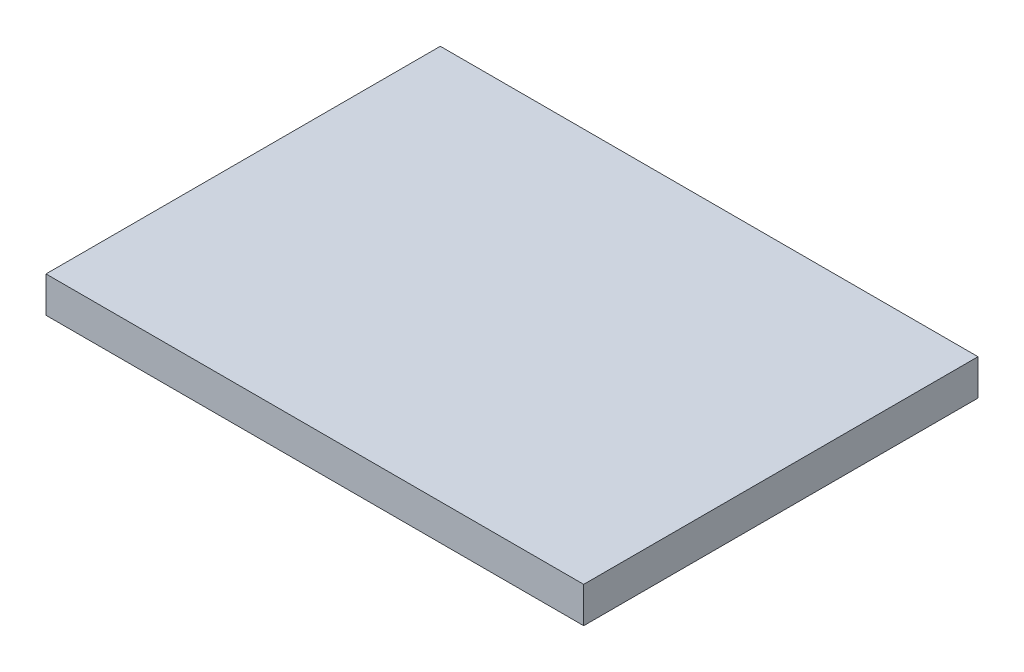
ISO-10303-21;
HEADER;
FILE_DESCRIPTION(('STEP AP214'),'2;1');
FILE_NAME('part.step','',(''),(''),'','','');
FILE_SCHEMA(('AUTOMOTIVE_DESIGN { 1 0 10303 214 1 1 1 1 }'));
ENDSEC;
DATA;
#1=APPLICATION_CONTEXT('core data for automotive mechanical design processes');
#2=APPLICATION_PROTOCOL_DEFINITION('international standard','automotive_design',2000,#1);
#3=PRODUCT_CONTEXT('',#1,'mechanical');
#4=PRODUCT('Part','Part','',(#3));
#5=PRODUCT_RELATED_PRODUCT_CATEGORY('part','',(#4));
#6=PRODUCT_DEFINITION_FORMATION('','',#4);
#7=PRODUCT_DEFINITION_CONTEXT('part definition',#1,'design');
#8=PRODUCT_DEFINITION('design','',#6,#7);
#9=PRODUCT_DEFINITION_SHAPE('','',#8);
#10=(LENGTH_UNIT() NAMED_UNIT(*) SI_UNIT(.MILLI.,.METRE.));
#11=(NAMED_UNIT(*) PLANE_ANGLE_UNIT() SI_UNIT($,.RADIAN.));
#12=(NAMED_UNIT(*) SI_UNIT($,.STERADIAN.) SOLID_ANGLE_UNIT());
#13=UNCERTAINTY_MEASURE_WITH_UNIT(LENGTH_MEASURE(1.E-05),#10,'distance_accuracy_value','');
#14=(GEOMETRIC_REPRESENTATION_CONTEXT(3) GLOBAL_UNCERTAINTY_ASSIGNED_CONTEXT((#13)) GLOBAL_UNIT_ASSIGNED_CONTEXT((#10,
#11,#12)) REPRESENTATION_CONTEXT('',''));
#15=CARTESIAN_POINT('',(0.,0.,0.));
#16=DIRECTION('',(0.,0.,1.));
#17=DIRECTION('',(1.,0.,0.));
#18=AXIS2_PLACEMENT_3D('',#15,#16,#17);
#19=CARTESIAN_POINT('',(7.5,1.,5.5));
#20=DIRECTION('',(-1.,0.,0.));
#21=DIRECTION('',(0.,0.,1.));
#22=AXIS2_PLACEMENT_3D('',#19,#20,#21);
#23=PLANE('',#22);
#24=DIRECTION('',(0.,0.,-1.));
#25=VECTOR('',#24,1.);
#26=CARTESIAN_POINT('',(7.5,0.,5.5));
#27=LINE('',#26,#25);
#28=CARTESIAN_POINT('',(7.5,0.,5.5));
#29=VERTEX_POINT('',#28);
#30=CARTESIAN_POINT('',(7.5,0.,-5.5));
#31=VERTEX_POINT('',#30);
#32=EDGE_CURVE('E99',#29,#31,#27,.T.);
#33=ORIENTED_EDGE('',*,*,#32,.T.);
#34=DIRECTION('',(0.,-1.,0.));
#35=VECTOR('',#34,1.);
#36=CARTESIAN_POINT('',(7.5,1.,-5.5));
#37=LINE('',#36,#35);
#38=CARTESIAN_POINT('',(7.5,1.,-5.5));
#39=VERTEX_POINT('',#38);
#40=EDGE_CURVE('E11',#39,#31,#37,.T.);
#41=ORIENTED_EDGE('',*,*,#40,.F.);
#42=DIRECTION('',(0.,0.,-1.));
#43=VECTOR('',#42,1.);
#44=CARTESIAN_POINT('',(7.5,1.,5.5));
#45=LINE('',#44,#43);
#46=CARTESIAN_POINT('',(7.5,1.,5.5));
#47=VERTEX_POINT('',#46);
#48=EDGE_CURVE('E87',#47,#39,#45,.T.);
#49=ORIENTED_EDGE('',*,*,#48,.F.);
#50=DIRECTION('',(0.,-1.,0.));
#51=VECTOR('',#50,1.);
#52=CARTESIAN_POINT('',(7.5,1.,5.5));
#53=LINE('',#52,#51);
#54=EDGE_CURVE('E95',#47,#29,#53,.T.);
#55=ORIENTED_EDGE('',*,*,#54,.T.);
#56=EDGE_LOOP('',(#33,#41,#49,#55));
#57=FACE_BOUND('',#56,.T.);
#58=ADVANCED_FACE('F36',(#57),#23,.F.);
#59=CARTESIAN_POINT('',(-7.5,1.,-5.5));
#60=DIRECTION('',(0.,0.,1.));
#61=DIRECTION('',(1.,0.,0.));
#62=AXIS2_PLACEMENT_3D('',#59,#60,#61);
#63=PLANE('',#62);
#64=DIRECTION('',(-1.,0.,0.));
#65=VECTOR('',#64,1.);
#66=CARTESIAN_POINT('',(-7.5,0.,-5.5));
#67=LINE('',#66,#65);
#68=CARTESIAN_POINT('',(-7.5,0.,-5.5));
#69=VERTEX_POINT('',#68);
#70=EDGE_CURVE('E91',#31,#69,#67,.T.);
#71=ORIENTED_EDGE('',*,*,#70,.T.);
#72=DIRECTION('',(0.,-1.,0.));
#73=VECTOR('',#72,1.);
#74=CARTESIAN_POINT('',(-7.5,1.,-5.5));
#75=LINE('',#74,#73);
#76=CARTESIAN_POINT('',(-7.5,1.,-5.5));
#77=VERTEX_POINT('',#76);
#78=EDGE_CURVE('E44',#77,#69,#75,.T.);
#79=ORIENTED_EDGE('',*,*,#78,.F.);
#80=DIRECTION('',(-1.,0.,0.));
#81=VECTOR('',#80,1.);
#82=CARTESIAN_POINT('',(-7.5,1.,-5.5));
#83=LINE('',#82,#81);
#84=EDGE_CURVE('E82',#39,#77,#83,.T.);
#85=ORIENTED_EDGE('',*,*,#84,.F.);
#86=ORIENTED_EDGE('',*,*,#40,.T.);
#87=EDGE_LOOP('',(#71,#79,#85,#86));
#88=FACE_BOUND('',#87,.T.);
#89=ADVANCED_FACE('F90',(#88),#63,.F.);
#90=CARTESIAN_POINT('',(-7.5,1.,5.5));
#91=DIRECTION('',(1.,0.,0.));
#92=DIRECTION('',(0.,0.,-1.));
#93=AXIS2_PLACEMENT_3D('',#90,#91,#92);
#94=PLANE('',#93);
#95=DIRECTION('',(0.,0.,1.));
#96=VECTOR('',#95,1.);
#97=CARTESIAN_POINT('',(-7.5,0.,5.5));
#98=LINE('',#97,#96);
#99=CARTESIAN_POINT('',(-7.5,0.,5.5));
#100=VERTEX_POINT('',#99);
#101=EDGE_CURVE('E69',#69,#100,#98,.T.);
#102=ORIENTED_EDGE('',*,*,#101,.T.);
#103=DIRECTION('',(0.,-1.,0.));
#104=VECTOR('',#103,1.);
#105=CARTESIAN_POINT('',(-7.5,1.,5.5));
#106=LINE('',#105,#104);
#107=CARTESIAN_POINT('',(-7.5,1.,5.5));
#108=VERTEX_POINT('',#107);
#109=EDGE_CURVE('E92',#108,#100,#106,.T.);
#110=ORIENTED_EDGE('',*,*,#109,.F.);
#111=DIRECTION('',(0.,0.,1.));
#112=VECTOR('',#111,1.);
#113=CARTESIAN_POINT('',(-7.5,1.,5.5));
#114=LINE('',#113,#112);
#115=EDGE_CURVE('E85',#77,#108,#114,.T.);
#116=ORIENTED_EDGE('',*,*,#115,.F.);
#117=ORIENTED_EDGE('',*,*,#78,.T.);
#118=EDGE_LOOP('',(#102,#110,#116,#117));
#119=FACE_BOUND('',#118,.T.);
#120=ADVANCED_FACE('F93',(#119),#94,.F.);
#121=CARTESIAN_POINT('',(-7.5,1.,5.5));
#122=DIRECTION('',(0.,0.,-1.));
#123=DIRECTION('',(-1.,0.,0.));
#124=AXIS2_PLACEMENT_3D('',#121,#122,#123);
#125=PLANE('',#124);
#126=DIRECTION('',(1.,0.,0.));
#127=VECTOR('',#126,1.);
#128=CARTESIAN_POINT('',(-7.5,0.,5.5));
#129=LINE('',#128,#127);
#130=EDGE_CURVE('E75',#100,#29,#129,.T.);
#131=ORIENTED_EDGE('',*,*,#130,.T.);
#132=ORIENTED_EDGE('',*,*,#54,.F.);
#133=DIRECTION('',(1.,0.,0.));
#134=VECTOR('',#133,1.);
#135=CARTESIAN_POINT('',(-7.5,1.,5.5));
#136=LINE('',#135,#134);
#137=EDGE_CURVE('E52',#108,#47,#136,.T.);
#138=ORIENTED_EDGE('',*,*,#137,.F.);
#139=ORIENTED_EDGE('',*,*,#109,.T.);
#140=EDGE_LOOP('',(#131,#132,#138,#139));
#141=FACE_BOUND('',#140,.T.);
#142=ADVANCED_FACE('F106',(#141),#125,.F.);
#143=CARTESIAN_POINT('',(0.,1.,0.));
#144=DIRECTION('',(0.,-1.,0.));
#145=DIRECTION('',(0.,0.,-1.));
#146=AXIS2_PLACEMENT_3D('',#143,#144,#145);
#147=PLANE('',#146);
#148=ORIENTED_EDGE('',*,*,#48,.T.);
#149=ORIENTED_EDGE('',*,*,#84,.T.);
#150=ORIENTED_EDGE('',*,*,#115,.T.);
#151=ORIENTED_EDGE('',*,*,#137,.T.);
#152=EDGE_LOOP('',(#148,#149,#150,#151));
#153=FACE_BOUND('',#152,.T.);
#154=ADVANCED_FACE('F83',(#153),#147,.F.);
#155=CARTESIAN_POINT('',(0.,0.,0.));
#156=DIRECTION('',(0.,-1.,0.));
#157=DIRECTION('',(0.,0.,-1.));
#158=AXIS2_PLACEMENT_3D('',#155,#156,#157);
#159=PLANE('',#158);
#160=ORIENTED_EDGE('',*,*,#32,.F.);
#161=ORIENTED_EDGE('',*,*,#130,.F.);
#162=ORIENTED_EDGE('',*,*,#101,.F.);
#163=ORIENTED_EDGE('',*,*,#70,.F.);
#164=EDGE_LOOP('',(#160,#161,#162,#163));
#165=FACE_BOUND('',#164,.T.);
#166=ADVANCED_FACE('F109',(#165),#159,.T.);
#167=CLOSED_SHELL('',(#58,#89,#120,#142,#154,#166));
#168=MANIFOLD_SOLID_BREP('B2',#167);
#169=ADVANCED_BREP_SHAPE_REPRESENTATION('',(#18,#168),#14);
#170=SHAPE_DEFINITION_REPRESENTATION(#9,#169);
ENDSEC;
END-ISO-10303-21;
